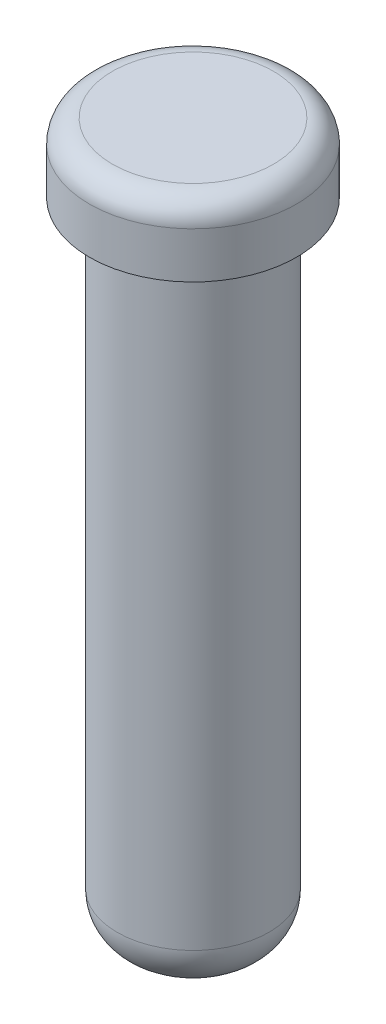
ISO-10303-21;
HEADER;
FILE_DESCRIPTION(('STEP AP214'),'2;1');
FILE_NAME('part.step','',(''),(''),'','','');
FILE_SCHEMA(('AUTOMOTIVE_DESIGN { 1 0 10303 214 1 1 1 1 }'));
ENDSEC;
DATA;
#1=APPLICATION_CONTEXT('core data for automotive mechanical design processes');
#2=APPLICATION_PROTOCOL_DEFINITION('international standard','automotive_design',2000,#1);
#3=PRODUCT_CONTEXT('',#1,'mechanical');
#4=PRODUCT('Part','Part','',(#3));
#5=PRODUCT_RELATED_PRODUCT_CATEGORY('part','',(#4));
#6=PRODUCT_DEFINITION_FORMATION('','',#4);
#7=PRODUCT_DEFINITION_CONTEXT('part definition',#1,'design');
#8=PRODUCT_DEFINITION('design','',#6,#7);
#9=PRODUCT_DEFINITION_SHAPE('','',#8);
#10=(LENGTH_UNIT() NAMED_UNIT(*) SI_UNIT(.MILLI.,.METRE.));
#11=(NAMED_UNIT(*) PLANE_ANGLE_UNIT() SI_UNIT($,.RADIAN.));
#12=(NAMED_UNIT(*) SI_UNIT($,.STERADIAN.) SOLID_ANGLE_UNIT());
#13=UNCERTAINTY_MEASURE_WITH_UNIT(LENGTH_MEASURE(1.E-05),#10,'distance_accuracy_value','');
#14=(GEOMETRIC_REPRESENTATION_CONTEXT(3) GLOBAL_UNCERTAINTY_ASSIGNED_CONTEXT((#13)) GLOBAL_UNIT_ASSIGNED_CONTEXT((#10,
#11,#12)) REPRESENTATION_CONTEXT('',''));
#15=CARTESIAN_POINT('',(0.,0.,0.));
#16=DIRECTION('',(0.,0.,1.));
#17=DIRECTION('',(1.,0.,0.));
#18=AXIS2_PLACEMENT_3D('',#15,#16,#17);
#19=CARTESIAN_POINT('',(0.,14.,0.));
#20=DIRECTION('',(0.,-1.,0.));
#21=DIRECTION('',(0.,0.,-1.));
#22=AXIS2_PLACEMENT_3D('',#19,#20,#21);
#23=CYLINDRICAL_SURFACE('',#22,1.65);
#24=CARTESIAN_POINT('',(0.,0.999999999999999,0.));
#25=DIRECTION('',(0.,1.,0.));
#26=DIRECTION('',(0.,0.,1.));
#27=AXIS2_PLACEMENT_3D('',#24,#25,#26);
#28=CIRCLE('',#27,1.65);
#29=CARTESIAN_POINT('',(0.,0.999999999999999,1.65));
#30=VERTEX_POINT('',#29);
#31=EDGE_CURVE('E44',#30,#30,#28,.T.);
#32=ORIENTED_EDGE('',*,*,#31,.T.);
#33=EDGE_LOOP('',(#32));
#34=FACE_BOUND('',#33,.T.);
#35=CARTESIAN_POINT('',(0.,14.,0.));
#36=DIRECTION('',(0.,1.,0.));
#37=DIRECTION('',(0.,0.,1.));
#38=AXIS2_PLACEMENT_3D('',#35,#36,#37);
#39=CIRCLE('',#38,1.65);
#40=CARTESIAN_POINT('',(0.,14.,1.65));
#41=VERTEX_POINT('',#40);
#42=EDGE_CURVE('E57',#41,#41,#39,.T.);
#43=ORIENTED_EDGE('',*,*,#42,.F.);
#44=EDGE_LOOP('',(#43));
#45=FACE_BOUND('',#44,.T.);
#46=ADVANCED_FACE('F37',(#34,#45),#23,.T.);
#47=CARTESIAN_POINT('',(0.,0.,0.));
#48=DIRECTION('',(0.,1.,0.));
#49=DIRECTION('',(0.,0.,1.));
#50=AXIS2_PLACEMENT_3D('',#47,#48,#49);
#51=PLANE('',#50);
#52=CARTESIAN_POINT('',(0.,0.,0.));
#53=DIRECTION('',(0.,1.,0.));
#54=DIRECTION('',(0.,0.,1.));
#55=AXIS2_PLACEMENT_3D('',#52,#53,#54);
#56=CIRCLE('',#55,0.65);
#57=CARTESIAN_POINT('',(0.,0.,0.65));
#58=VERTEX_POINT('',#57);
#59=EDGE_CURVE('E10',#58,#58,#56,.F.);
#60=ORIENTED_EDGE('',*,*,#59,.T.);
#61=EDGE_LOOP('',(#60));
#62=FACE_BOUND('',#61,.T.);
#63=ADVANCED_FACE('F82',(#62),#51,.F.);
#64=CARTESIAN_POINT('',(0.,15.5,0.));
#65=DIRECTION('',(0.,-1.,0.));
#66=DIRECTION('',(0.,0.,-1.));
#67=AXIS2_PLACEMENT_3D('',#64,#65,#66);
#68=CYLINDRICAL_SURFACE('',#67,2.25);
#69=CARTESIAN_POINT('',(0.,15.,0.));
#70=DIRECTION('',(0.,1.,0.));
#71=DIRECTION('',(0.,0.,1.));
#72=AXIS2_PLACEMENT_3D('',#69,#70,#71);
#73=CIRCLE('',#72,2.25);
#74=CARTESIAN_POINT('',(0.,15.,2.25));
#75=VERTEX_POINT('',#74);
#76=EDGE_CURVE('E48',#75,#75,#73,.F.);
#77=ORIENTED_EDGE('',*,*,#76,.T.);
#78=EDGE_LOOP('',(#77));
#79=FACE_BOUND('',#78,.T.);
#80=CARTESIAN_POINT('',(0.,14.,0.));
#81=DIRECTION('',(0.,1.,0.));
#82=DIRECTION('',(0.,0.,1.));
#83=AXIS2_PLACEMENT_3D('',#80,#81,#82);
#84=CIRCLE('',#83,2.25);
#85=CARTESIAN_POINT('',(0.,14.,2.25));
#86=VERTEX_POINT('',#85);
#87=EDGE_CURVE('E60',#86,#86,#84,.T.);
#88=ORIENTED_EDGE('',*,*,#87,.T.);
#89=EDGE_LOOP('',(#88));
#90=FACE_BOUND('',#89,.T.);
#91=ADVANCED_FACE('F64',(#79,#90),#68,.T.);
#92=CARTESIAN_POINT('',(0.,15.5,0.));
#93=DIRECTION('',(0.,1.,0.));
#94=DIRECTION('',(0.,0.,1.));
#95=AXIS2_PLACEMENT_3D('',#92,#93,#94);
#96=PLANE('',#95);
#97=CARTESIAN_POINT('',(0.,15.5,0.));
#98=DIRECTION('',(0.,1.,0.));
#99=DIRECTION('',(0.,0.,1.));
#100=AXIS2_PLACEMENT_3D('',#97,#98,#99);
#101=CIRCLE('',#100,1.75);
#102=CARTESIAN_POINT('',(0.,15.5,1.75));
#103=VERTEX_POINT('',#102);
#104=EDGE_CURVE('E52',#103,#103,#101,.T.);
#105=ORIENTED_EDGE('',*,*,#104,.T.);
#106=EDGE_LOOP('',(#105));
#107=FACE_BOUND('',#106,.T.);
#108=ADVANCED_FACE('F69',(#107),#96,.T.);
#109=CARTESIAN_POINT('',(0.,14.,0.));
#110=DIRECTION('',(0.,1.,0.));
#111=DIRECTION('',(0.,0.,1.));
#112=AXIS2_PLACEMENT_3D('',#109,#110,#111);
#113=PLANE('',#112);
#114=ORIENTED_EDGE('',*,*,#42,.T.);
#115=EDGE_LOOP('',(#114));
#116=FACE_BOUND('',#115,.T.);
#117=ORIENTED_EDGE('',*,*,#87,.F.);
#118=EDGE_LOOP('',(#117));
#119=FACE_BOUND('',#118,.T.);
#120=ADVANCED_FACE('F66',(#116,#119),#113,.F.);
#121=CARTESIAN_POINT('',(0.,15.,0.));
#122=DIRECTION('',(0.,1.,0.));
#123=DIRECTION('',(0.,0.,1.));
#124=AXIS2_PLACEMENT_3D('',#121,#122,#123);
#125=TOROIDAL_SURFACE('',#124,1.75,0.5);
#126=ORIENTED_EDGE('',*,*,#76,.F.);
#127=EDGE_LOOP('',(#126));
#128=FACE_BOUND('',#127,.T.);
#129=ORIENTED_EDGE('',*,*,#104,.F.);
#130=EDGE_LOOP('',(#129));
#131=FACE_BOUND('',#130,.T.);
#132=ADVANCED_FACE('F68',(#128,#131),#125,.T.);
#133=CARTESIAN_POINT('',(0.,0.999999999999999,0.));
#134=DIRECTION('',(0.,1.,0.));
#135=DIRECTION('',(0.,0.,1.));
#136=AXIS2_PLACEMENT_3D('',#133,#134,#135);
#137=DEGENERATE_TOROIDAL_SURFACE('',#136,0.65,1.,.T.);
#138=ORIENTED_EDGE('',*,*,#59,.F.);
#139=EDGE_LOOP('',(#138));
#140=FACE_BOUND('',#139,.T.);
#141=ORIENTED_EDGE('',*,*,#31,.F.);
#142=EDGE_LOOP('',(#141));
#143=FACE_BOUND('',#142,.T.);
#144=ADVANCED_FACE('F39',(#140,#143),#137,.T.);
#145=CLOSED_SHELL('',(#46,#63,#91,#108,#120,#132,#144));
#146=MANIFOLD_SOLID_BREP('B2',#145);
#147=ADVANCED_BREP_SHAPE_REPRESENTATION('',(#18,#146),#14);
#148=SHAPE_DEFINITION_REPRESENTATION(#9,#147);
ENDSEC;
END-ISO-10303-21;
